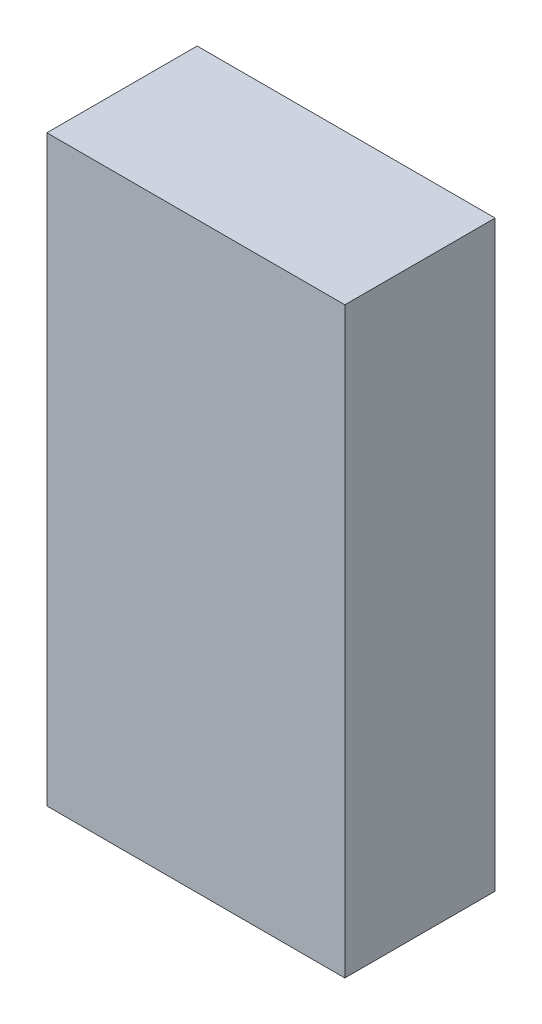
ISO-10303-21;
HEADER;
FILE_DESCRIPTION(('STEP AP214'),'2;1');
FILE_NAME('part.step','',(''),(''),'','','');
FILE_SCHEMA(('AUTOMOTIVE_DESIGN { 1 0 10303 214 1 1 1 1 }'));
ENDSEC;
DATA;
#1=APPLICATION_CONTEXT('core data for automotive mechanical design processes');
#2=APPLICATION_PROTOCOL_DEFINITION('international standard','automotive_design',2000,#1);
#3=PRODUCT_CONTEXT('',#1,'mechanical');
#4=PRODUCT('Part','Part','',(#3));
#5=PRODUCT_RELATED_PRODUCT_CATEGORY('part','',(#4));
#6=PRODUCT_DEFINITION_FORMATION('','',#4);
#7=PRODUCT_DEFINITION_CONTEXT('part definition',#1,'design');
#8=PRODUCT_DEFINITION('design','',#6,#7);
#9=PRODUCT_DEFINITION_SHAPE('','',#8);
#10=(LENGTH_UNIT() NAMED_UNIT(*) SI_UNIT(.MILLI.,.METRE.));
#11=(NAMED_UNIT(*) PLANE_ANGLE_UNIT() SI_UNIT($,.RADIAN.));
#12=(NAMED_UNIT(*) SI_UNIT($,.STERADIAN.) SOLID_ANGLE_UNIT());
#13=UNCERTAINTY_MEASURE_WITH_UNIT(LENGTH_MEASURE(1.E-05),#10,'distance_accuracy_value','');
#14=(GEOMETRIC_REPRESENTATION_CONTEXT(3) GLOBAL_UNCERTAINTY_ASSIGNED_CONTEXT((#13)) GLOBAL_UNIT_ASSIGNED_CONTEXT((#10,
#11,#12)) REPRESENTATION_CONTEXT('',''));
#15=CARTESIAN_POINT('',(0.,0.,0.));
#16=DIRECTION('',(0.,0.,1.));
#17=DIRECTION('',(1.,0.,0.));
#18=AXIS2_PLACEMENT_3D('',#15,#16,#17);
#19=CARTESIAN_POINT('',(0.,22.1,0.));
#20=DIRECTION('',(0.,-1.,0.));
#21=DIRECTION('',(0.,0.,-1.));
#22=AXIS2_PLACEMENT_3D('',#19,#20,#21);
#23=PLANE('',#22);
#24=DIRECTION('',(1.,0.,0.));
#25=VECTOR('',#24,1.);
#26=CARTESIAN_POINT('',(5.35,22.1,5.4));
#27=LINE('',#26,#25);
#28=CARTESIAN_POINT('',(5.35,22.1,5.4));
#29=VERTEX_POINT('',#28);
#30=CARTESIAN_POINT('',(-5.35,22.1,5.4));
#31=VERTEX_POINT('',#30);
#32=EDGE_CURVE('E20',#29,#31,#27,.F.);
#33=ORIENTED_EDGE('',*,*,#32,.T.);
#34=DIRECTION('',(0.,0.,1.));
#35=VECTOR('',#34,1.);
#36=CARTESIAN_POINT('',(-5.35,22.1,5.4));
#37=LINE('',#36,#35);
#38=CARTESIAN_POINT('',(-5.35,22.1,0.4));
#39=VERTEX_POINT('',#38);
#40=EDGE_CURVE('E103',#31,#39,#37,.F.);
#41=ORIENTED_EDGE('',*,*,#40,.T.);
#42=DIRECTION('',(-1.,0.,0.));
#43=VECTOR('',#42,1.);
#44=CARTESIAN_POINT('',(-5.35,22.1,0.4));
#45=LINE('',#44,#43);
#46=CARTESIAN_POINT('',(5.35,22.1,0.4));
#47=VERTEX_POINT('',#46);
#48=EDGE_CURVE('E95',#39,#47,#45,.F.);
#49=ORIENTED_EDGE('',*,*,#48,.T.);
#50=DIRECTION('',(0.,0.,-1.));
#51=VECTOR('',#50,1.);
#52=CARTESIAN_POINT('',(5.35,22.1,0.4));
#53=LINE('',#52,#51);
#54=EDGE_CURVE('E79',#47,#29,#53,.F.);
#55=ORIENTED_EDGE('',*,*,#54,.T.);
#56=EDGE_LOOP('',(#33,#41,#49,#55));
#57=FACE_BOUND('',#56,.T.);
#58=ADVANCED_FACE('F17',(#57),#23,.T.);
#59=CARTESIAN_POINT('',(5.35,0.,5.4));
#60=DIRECTION('',(0.,0.,1.));
#61=DIRECTION('',(1.,0.,0.));
#62=AXIS2_PLACEMENT_3D('',#59,#60,#61);
#63=PLANE('',#62);
#64=ORIENTED_EDGE('',*,*,#32,.F.);
#65=DIRECTION('',(0.,1.,0.));
#66=VECTOR('',#65,1.);
#67=CARTESIAN_POINT('',(5.35,0.,5.4));
#68=LINE('',#67,#66);
#69=CARTESIAN_POINT('',(5.35,0.,5.4));
#70=VERTEX_POINT('',#69);
#71=EDGE_CURVE('E87',#29,#70,#68,.F.);
#72=ORIENTED_EDGE('',*,*,#71,.T.);
#73=DIRECTION('',(1.,0.,0.));
#74=VECTOR('',#73,1.);
#75=CARTESIAN_POINT('',(-5.75,0.,5.4));
#76=LINE('',#75,#74);
#77=CARTESIAN_POINT('',(-5.35,0.,5.4));
#78=VERTEX_POINT('',#77);
#79=EDGE_CURVE('E114',#78,#70,#76,.T.);
#80=ORIENTED_EDGE('',*,*,#79,.F.);
#81=DIRECTION('',(0.,1.,0.));
#82=VECTOR('',#81,1.);
#83=CARTESIAN_POINT('',(-5.35,0.,5.4));
#84=LINE('',#83,#82);
#85=EDGE_CURVE('E89',#78,#31,#84,.T.);
#86=ORIENTED_EDGE('',*,*,#85,.T.);
#87=EDGE_LOOP('',(#64,#72,#80,#86));
#88=FACE_BOUND('',#87,.T.);
#89=ADVANCED_FACE('F85',(#88),#63,.F.);
#90=CARTESIAN_POINT('',(5.35,0.,0.4));
#91=DIRECTION('',(1.,0.,0.));
#92=DIRECTION('',(0.,0.,-1.));
#93=AXIS2_PLACEMENT_3D('',#90,#91,#92);
#94=PLANE('',#93);
#95=ORIENTED_EDGE('',*,*,#54,.F.);
#96=DIRECTION('',(0.,1.,0.));
#97=VECTOR('',#96,1.);
#98=CARTESIAN_POINT('',(5.35,0.,0.4));
#99=LINE('',#98,#97);
#100=CARTESIAN_POINT('',(5.35,0.,0.4));
#101=VERTEX_POINT('',#100);
#102=EDGE_CURVE('E100',#47,#101,#99,.F.);
#103=ORIENTED_EDGE('',*,*,#102,.T.);
#104=DIRECTION('',(0.,0.,-1.));
#105=VECTOR('',#104,1.);
#106=CARTESIAN_POINT('',(5.35,0.,0.));
#107=LINE('',#106,#105);
#108=EDGE_CURVE('E94',#70,#101,#107,.T.);
#109=ORIENTED_EDGE('',*,*,#108,.F.);
#110=ORIENTED_EDGE('',*,*,#71,.F.);
#111=EDGE_LOOP('',(#95,#103,#109,#110));
#112=FACE_BOUND('',#111,.T.);
#113=ADVANCED_FACE('F93',(#112),#94,.F.);
#114=CARTESIAN_POINT('',(-5.35,0.,0.4));
#115=DIRECTION('',(0.,0.,-1.));
#116=DIRECTION('',(-1.,0.,0.));
#117=AXIS2_PLACEMENT_3D('',#114,#115,#116);
#118=PLANE('',#117);
#119=ORIENTED_EDGE('',*,*,#48,.F.);
#120=DIRECTION('',(0.,1.,0.));
#121=VECTOR('',#120,1.);
#122=CARTESIAN_POINT('',(-5.35,0.,0.4));
#123=LINE('',#122,#121);
#124=CARTESIAN_POINT('',(-5.35,0.,0.4));
#125=VERTEX_POINT('',#124);
#126=EDGE_CURVE('E105',#39,#125,#123,.F.);
#127=ORIENTED_EDGE('',*,*,#126,.T.);
#128=DIRECTION('',(1.,0.,0.));
#129=VECTOR('',#128,1.);
#130=CARTESIAN_POINT('',(-5.75,0.,0.4));
#131=LINE('',#130,#129);
#132=EDGE_CURVE('E117',#101,#125,#131,.F.);
#133=ORIENTED_EDGE('',*,*,#132,.F.);
#134=ORIENTED_EDGE('',*,*,#102,.F.);
#135=EDGE_LOOP('',(#119,#127,#133,#134));
#136=FACE_BOUND('',#135,.T.);
#137=ADVANCED_FACE('F178',(#136),#118,.F.);
#138=CARTESIAN_POINT('',(-5.35,0.,5.4));
#139=DIRECTION('',(-1.,0.,0.));
#140=DIRECTION('',(0.,0.,1.));
#141=AXIS2_PLACEMENT_3D('',#138,#139,#140);
#142=PLANE('',#141);
#143=ORIENTED_EDGE('',*,*,#40,.F.);
#144=ORIENTED_EDGE('',*,*,#85,.F.);
#145=DIRECTION('',(0.,0.,-1.));
#146=VECTOR('',#145,1.);
#147=CARTESIAN_POINT('',(-5.35,0.,0.));
#148=LINE('',#147,#146);
#149=EDGE_CURVE('E119',#125,#78,#148,.F.);
#150=ORIENTED_EDGE('',*,*,#149,.F.);
#151=ORIENTED_EDGE('',*,*,#126,.F.);
#152=EDGE_LOOP('',(#143,#144,#150,#151));
#153=FACE_BOUND('',#152,.T.);
#154=ADVANCED_FACE('F174',(#153),#142,.F.);
#155=CARTESIAN_POINT('',(0.,0.,5.8));
#156=DIRECTION('',(0.,0.,1.));
#157=DIRECTION('',(1.,0.,0.));
#158=AXIS2_PLACEMENT_3D('',#155,#156,#157);
#159=PLANE('',#158);
#160=DIRECTION('',(1.,0.,0.));
#161=VECTOR('',#160,1.);
#162=CARTESIAN_POINT('',(5.75,22.5,5.8));
#163=LINE('',#162,#161);
#164=CARTESIAN_POINT('',(-5.75,22.5,5.8));
#165=VERTEX_POINT('',#164);
#166=CARTESIAN_POINT('',(5.75,22.5,5.8));
#167=VERTEX_POINT('',#166);
#168=EDGE_CURVE('E129',#165,#167,#163,.T.);
#169=ORIENTED_EDGE('',*,*,#168,.F.);
#170=DIRECTION('',(0.,1.,0.));
#171=VECTOR('',#170,1.);
#172=CARTESIAN_POINT('',(-5.75,22.5,5.8));
#173=LINE('',#172,#171);
#174=CARTESIAN_POINT('',(-5.75,0.,5.8));
#175=VERTEX_POINT('',#174);
#176=EDGE_CURVE('E108',#175,#165,#173,.T.);
#177=ORIENTED_EDGE('',*,*,#176,.F.);
#178=DIRECTION('',(1.,0.,0.));
#179=VECTOR('',#178,1.);
#180=CARTESIAN_POINT('',(-5.75,0.,5.8));
#181=LINE('',#180,#179);
#182=CARTESIAN_POINT('',(5.75,0.,5.8));
#183=VERTEX_POINT('',#182);
#184=EDGE_CURVE('E110',#183,#175,#181,.F.);
#185=ORIENTED_EDGE('',*,*,#184,.F.);
#186=DIRECTION('',(0.,1.,0.));
#187=VECTOR('',#186,1.);
#188=CARTESIAN_POINT('',(5.75,0.,5.8));
#189=LINE('',#188,#187);
#190=EDGE_CURVE('E122',#167,#183,#189,.F.);
#191=ORIENTED_EDGE('',*,*,#190,.F.);
#192=EDGE_LOOP('',(#169,#177,#185,#191));
#193=FACE_BOUND('',#192,.T.);
#194=ADVANCED_FACE('F171',(#193),#159,.T.);
#195=CARTESIAN_POINT('',(-5.75,22.5,0.));
#196=DIRECTION('',(-1.,0.,0.));
#197=DIRECTION('',(0.,0.,1.));
#198=AXIS2_PLACEMENT_3D('',#195,#196,#197);
#199=PLANE('',#198);
#200=DIRECTION('',(0.,0.,1.));
#201=VECTOR('',#200,1.);
#202=CARTESIAN_POINT('',(-5.75,22.5,0.));
#203=LINE('',#202,#201);
#204=CARTESIAN_POINT('',(-5.75,22.5,0.));
#205=VERTEX_POINT('',#204);
#206=EDGE_CURVE('E126',#205,#165,#203,.T.);
#207=ORIENTED_EDGE('',*,*,#206,.F.);
#208=DIRECTION('',(0.,1.,0.));
#209=VECTOR('',#208,1.);
#210=CARTESIAN_POINT('',(-5.75,0.,0.));
#211=LINE('',#210,#209);
#212=CARTESIAN_POINT('',(-5.75,0.,0.));
#213=VERTEX_POINT('',#212);
#214=EDGE_CURVE('E132',#205,#213,#211,.F.);
#215=ORIENTED_EDGE('',*,*,#214,.T.);
#216=DIRECTION('',(0.,0.,-1.));
#217=VECTOR('',#216,1.);
#218=CARTESIAN_POINT('',(-5.75,0.,0.));
#219=LINE('',#218,#217);
#220=EDGE_CURVE('E112',#175,#213,#219,.T.);
#221=ORIENTED_EDGE('',*,*,#220,.F.);
#222=ORIENTED_EDGE('',*,*,#176,.T.);
#223=EDGE_LOOP('',(#207,#215,#221,#222));
#224=FACE_BOUND('',#223,.T.);
#225=ADVANCED_FACE('F153',(#224),#199,.T.);
#226=CARTESIAN_POINT('',(-5.75,0.,0.));
#227=DIRECTION('',(0.,-1.,0.));
#228=DIRECTION('',(0.,0.,-1.));
#229=AXIS2_PLACEMENT_3D('',#226,#227,#228);
#230=PLANE('',#229);
#231=ORIENTED_EDGE('',*,*,#132,.T.);
#232=ORIENTED_EDGE('',*,*,#149,.T.);
#233=ORIENTED_EDGE('',*,*,#79,.T.);
#234=ORIENTED_EDGE('',*,*,#108,.T.);
#235=EDGE_LOOP('',(#231,#232,#233,#234));
#236=FACE_BOUND('',#235,.T.);
#237=ORIENTED_EDGE('',*,*,#220,.T.);
#238=DIRECTION('',(1.,0.,0.));
#239=VECTOR('',#238,1.);
#240=CARTESIAN_POINT('',(0.,0.,0.));
#241=LINE('',#240,#239);
#242=CARTESIAN_POINT('',(5.75,0.,0.));
#243=VERTEX_POINT('',#242);
#244=EDGE_CURVE('E135',#213,#243,#241,.T.);
#245=ORIENTED_EDGE('',*,*,#244,.T.);
#246=DIRECTION('',(0.,0.,-1.));
#247=VECTOR('',#246,1.);
#248=CARTESIAN_POINT('',(5.75,0.,0.));
#249=LINE('',#248,#247);
#250=EDGE_CURVE('E124',#183,#243,#249,.T.);
#251=ORIENTED_EDGE('',*,*,#250,.F.);
#252=ORIENTED_EDGE('',*,*,#184,.T.);
#253=EDGE_LOOP('',(#237,#245,#251,#252));
#254=FACE_BOUND('',#253,.T.);
#255=ADVANCED_FACE('F147',(#236,#254),#230,.T.);
#256=CARTESIAN_POINT('',(5.75,0.,0.));
#257=DIRECTION('',(1.,0.,0.));
#258=DIRECTION('',(0.,0.,-1.));
#259=AXIS2_PLACEMENT_3D('',#256,#257,#258);
#260=PLANE('',#259);
#261=ORIENTED_EDGE('',*,*,#250,.T.);
#262=DIRECTION('',(0.,1.,0.));
#263=VECTOR('',#262,1.);
#264=CARTESIAN_POINT('',(5.75,0.,0.));
#265=LINE('',#264,#263);
#266=CARTESIAN_POINT('',(5.75,22.5,0.));
#267=VERTEX_POINT('',#266);
#268=EDGE_CURVE('E26',#243,#267,#265,.T.);
#269=ORIENTED_EDGE('',*,*,#268,.T.);
#270=DIRECTION('',(0.,0.,1.));
#271=VECTOR('',#270,1.);
#272=CARTESIAN_POINT('',(5.75,22.5,0.));
#273=LINE('',#272,#271);
#274=EDGE_CURVE('E34',#167,#267,#273,.F.);
#275=ORIENTED_EDGE('',*,*,#274,.F.);
#276=ORIENTED_EDGE('',*,*,#190,.T.);
#277=EDGE_LOOP('',(#261,#269,#275,#276));
#278=FACE_BOUND('',#277,.T.);
#279=ADVANCED_FACE('F141',(#278),#260,.T.);
#280=CARTESIAN_POINT('',(5.75,22.5,0.));
#281=DIRECTION('',(0.,1.,0.));
#282=DIRECTION('',(0.,0.,1.));
#283=AXIS2_PLACEMENT_3D('',#280,#281,#282);
#284=PLANE('',#283);
#285=ORIENTED_EDGE('',*,*,#274,.T.);
#286=DIRECTION('',(1.,0.,0.));
#287=VECTOR('',#286,1.);
#288=CARTESIAN_POINT('',(0.,22.5,0.));
#289=LINE('',#288,#287);
#290=EDGE_CURVE('E11',#267,#205,#289,.F.);
#291=ORIENTED_EDGE('',*,*,#290,.T.);
#292=ORIENTED_EDGE('',*,*,#206,.T.);
#293=ORIENTED_EDGE('',*,*,#168,.T.);
#294=EDGE_LOOP('',(#285,#291,#292,#293));
#295=FACE_BOUND('',#294,.T.);
#296=ADVANCED_FACE('F155',(#295),#284,.T.);
#297=CARTESIAN_POINT('',(0.,0.,0.));
#298=DIRECTION('',(0.,0.,1.));
#299=DIRECTION('',(1.,0.,0.));
#300=AXIS2_PLACEMENT_3D('',#297,#298,#299);
#301=PLANE('',#300);
#302=ORIENTED_EDGE('',*,*,#268,.F.);
#303=ORIENTED_EDGE('',*,*,#244,.F.);
#304=ORIENTED_EDGE('',*,*,#214,.F.);
#305=ORIENTED_EDGE('',*,*,#290,.F.);
#306=EDGE_LOOP('',(#302,#303,#304,#305));
#307=FACE_BOUND('',#306,.T.);
#308=ADVANCED_FACE('F145',(#307),#301,.F.);
#309=CLOSED_SHELL('',(#58,#89,#113,#137,#154,#194,#225,#255,#279,#296,#308));
#310=MANIFOLD_SOLID_BREP('B1',#309);
#311=ADVANCED_BREP_SHAPE_REPRESENTATION('',(#18,#310),#14);
#312=SHAPE_DEFINITION_REPRESENTATION(#9,#311);
ENDSEC;
END-ISO-10303-21;
